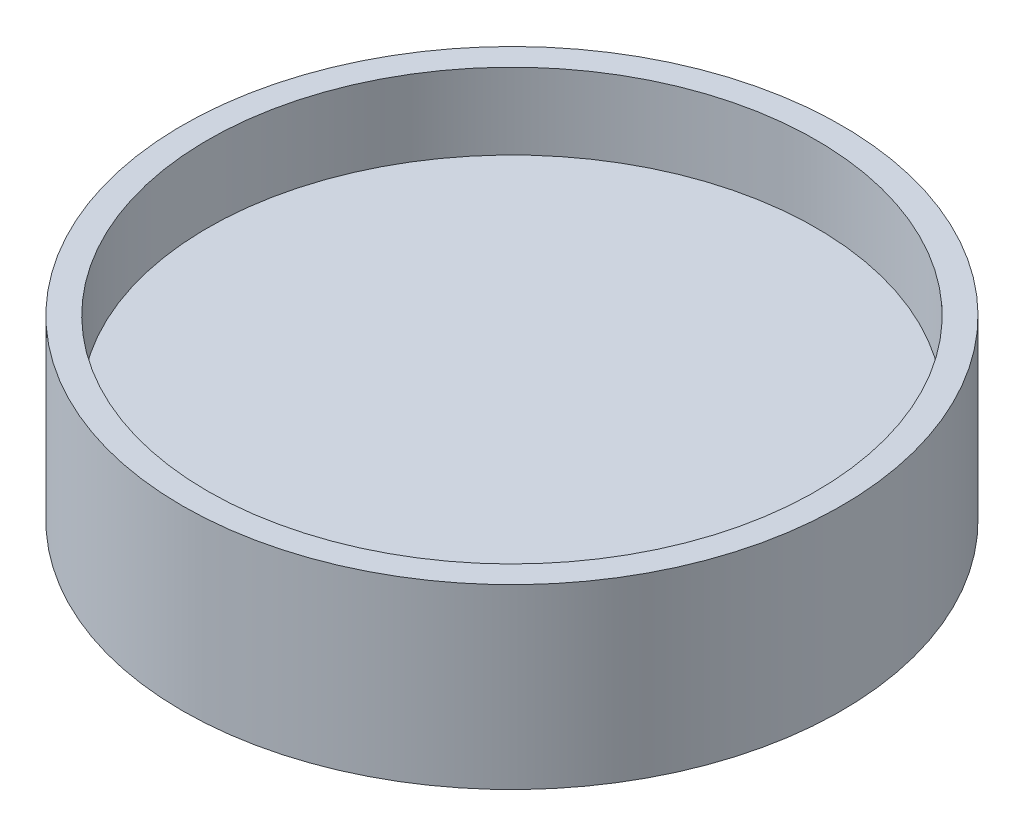
ISO-10303-21;
HEADER;
FILE_DESCRIPTION(('STEP AP214'),'2;1');
FILE_NAME('part.step','',(''),(''),'','','');
FILE_SCHEMA(('AUTOMOTIVE_DESIGN { 1 0 10303 214 1 1 1 1 }'));
ENDSEC;
DATA;
#1=APPLICATION_CONTEXT('core data for automotive mechanical design processes');
#2=APPLICATION_PROTOCOL_DEFINITION('international standard','automotive_design',2000,#1);
#3=PRODUCT_CONTEXT('',#1,'mechanical');
#4=PRODUCT('Part','Part','',(#3));
#5=PRODUCT_RELATED_PRODUCT_CATEGORY('part','',(#4));
#6=PRODUCT_DEFINITION_FORMATION('','',#4);
#7=PRODUCT_DEFINITION_CONTEXT('part definition',#1,'design');
#8=PRODUCT_DEFINITION('design','',#6,#7);
#9=PRODUCT_DEFINITION_SHAPE('','',#8);
#10=(LENGTH_UNIT() NAMED_UNIT(*) SI_UNIT(.MILLI.,.METRE.));
#11=(NAMED_UNIT(*) PLANE_ANGLE_UNIT() SI_UNIT($,.RADIAN.));
#12=(NAMED_UNIT(*) SI_UNIT($,.STERADIAN.) SOLID_ANGLE_UNIT());
#13=UNCERTAINTY_MEASURE_WITH_UNIT(LENGTH_MEASURE(1.E-05),#10,'distance_accuracy_value','');
#14=(GEOMETRIC_REPRESENTATION_CONTEXT(3) GLOBAL_UNCERTAINTY_ASSIGNED_CONTEXT((#13)) GLOBAL_UNIT_ASSIGNED_CONTEXT((#10,
#11,#12)) REPRESENTATION_CONTEXT('',''));
#15=CARTESIAN_POINT('',(0.,0.,0.));
#16=DIRECTION('',(0.,0.,1.));
#17=DIRECTION('',(1.,0.,0.));
#18=AXIS2_PLACEMENT_3D('',#15,#16,#17);
#19=CARTESIAN_POINT('',(0.,7.,0.));
#20=DIRECTION('',(0.,-1.,0.));
#21=DIRECTION('',(0.,0.,-1.));
#22=AXIS2_PLACEMENT_3D('',#19,#20,#21);
#23=CYLINDRICAL_SURFACE('',#22,13.);
#24=CARTESIAN_POINT('',(0.,7.,0.));
#25=DIRECTION('',(0.,1.,0.));
#26=DIRECTION('',(0.,0.,1.));
#27=AXIS2_PLACEMENT_3D('',#24,#25,#26);
#28=CIRCLE('',#27,13.);
#29=CARTESIAN_POINT('',(0.,7.,13.));
#30=VERTEX_POINT('',#29);
#31=EDGE_CURVE('E10',#30,#30,#28,.T.);
#32=ORIENTED_EDGE('',*,*,#31,.F.);
#33=EDGE_LOOP('',(#32));
#34=FACE_BOUND('',#33,.T.);
#35=CARTESIAN_POINT('',(0.,0.,0.));
#36=DIRECTION('',(0.,1.,0.));
#37=DIRECTION('',(0.,0.,1.));
#38=AXIS2_PLACEMENT_3D('',#35,#36,#37);
#39=CIRCLE('',#38,13.);
#40=CARTESIAN_POINT('',(0.,0.,13.));
#41=VERTEX_POINT('',#40);
#42=EDGE_CURVE('E40',#41,#41,#39,.T.);
#43=ORIENTED_EDGE('',*,*,#42,.T.);
#44=EDGE_LOOP('',(#43));
#45=FACE_BOUND('',#44,.T.);
#46=ADVANCED_FACE('F37',(#34,#45),#23,.T.);
#47=CARTESIAN_POINT('',(0.,7.,0.));
#48=DIRECTION('',(0.,1.,0.));
#49=DIRECTION('',(0.,0.,1.));
#50=AXIS2_PLACEMENT_3D('',#47,#48,#49);
#51=PLANE('',#50);
#52=CARTESIAN_POINT('',(0.,7.,0.));
#53=DIRECTION('',(0.,1.,0.));
#54=DIRECTION('',(0.,0.,1.));
#55=AXIS2_PLACEMENT_3D('',#52,#53,#54);
#56=CIRCLE('',#55,12.);
#57=CARTESIAN_POINT('',(0.,7.,12.));
#58=VERTEX_POINT('',#57);
#59=EDGE_CURVE('E51',#58,#58,#56,.T.);
#60=ORIENTED_EDGE('',*,*,#59,.F.);
#61=EDGE_LOOP('',(#60));
#62=FACE_BOUND('',#61,.T.);
#63=ORIENTED_EDGE('',*,*,#31,.T.);
#64=EDGE_LOOP('',(#63));
#65=FACE_BOUND('',#64,.T.);
#66=ADVANCED_FACE('F68',(#62,#65),#51,.T.);
#67=CARTESIAN_POINT('',(0.,0.,0.));
#68=DIRECTION('',(0.,1.,0.));
#69=DIRECTION('',(0.,0.,1.));
#70=AXIS2_PLACEMENT_3D('',#67,#68,#69);
#71=PLANE('',#70);
#72=ORIENTED_EDGE('',*,*,#42,.F.);
#73=EDGE_LOOP('',(#72));
#74=FACE_BOUND('',#73,.T.);
#75=ADVANCED_FACE('F64',(#74),#71,.F.);
#76=CARTESIAN_POINT('',(0.,4.,0.));
#77=DIRECTION('',(0.,1.,0.));
#78=DIRECTION('',(0.,0.,1.));
#79=AXIS2_PLACEMENT_3D('',#76,#77,#78);
#80=CYLINDRICAL_SURFACE('',#79,12.);
#81=CARTESIAN_POINT('',(0.,4.,0.));
#82=DIRECTION('',(0.,1.,0.));
#83=DIRECTION('',(0.,0.,1.));
#84=AXIS2_PLACEMENT_3D('',#81,#82,#83);
#85=CIRCLE('',#84,12.);
#86=CARTESIAN_POINT('',(0.,4.,12.));
#87=VERTEX_POINT('',#86);
#88=EDGE_CURVE('E49',#87,#87,#85,.T.);
#89=ORIENTED_EDGE('',*,*,#88,.F.);
#90=EDGE_LOOP('',(#89));
#91=FACE_BOUND('',#90,.T.);
#92=ORIENTED_EDGE('',*,*,#59,.T.);
#93=EDGE_LOOP('',(#92));
#94=FACE_BOUND('',#93,.T.);
#95=ADVANCED_FACE('F61',(#91,#94),#80,.F.);
#96=CARTESIAN_POINT('',(0.,4.,0.));
#97=DIRECTION('',(0.,1.,0.));
#98=DIRECTION('',(0.,0.,1.));
#99=AXIS2_PLACEMENT_3D('',#96,#97,#98);
#100=PLANE('',#99);
#101=ORIENTED_EDGE('',*,*,#88,.T.);
#102=EDGE_LOOP('',(#101));
#103=FACE_BOUND('',#102,.T.);
#104=ADVANCED_FACE('F59',(#103),#100,.T.);
#105=CLOSED_SHELL('',(#46,#66,#75,#95,#104));
#106=MANIFOLD_SOLID_BREP('B2',#105);
#107=ADVANCED_BREP_SHAPE_REPRESENTATION('',(#18,#106),#14);
#108=SHAPE_DEFINITION_REPRESENTATION(#9,#107);
ENDSEC;
END-ISO-10303-21;
